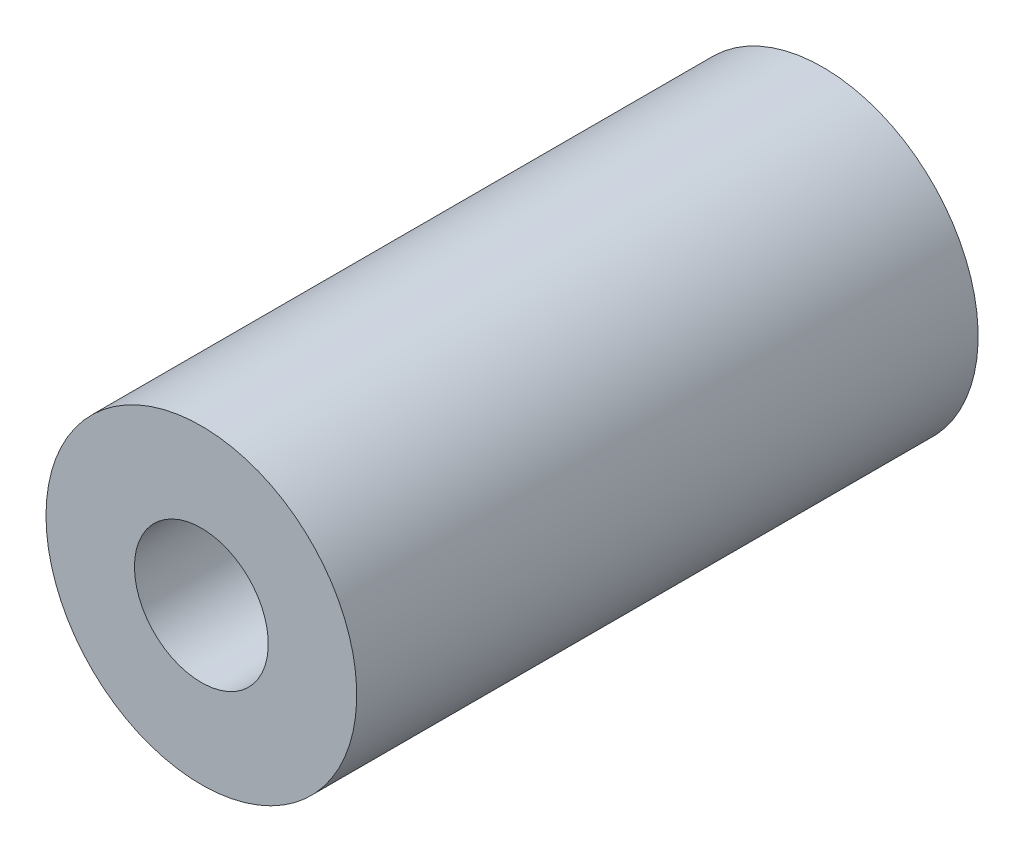
ISO-10303-21;
HEADER;
FILE_DESCRIPTION(('STEP AP214'),'2;1');
FILE_NAME('part.step','',(''),(''),'','','');
FILE_SCHEMA(('AUTOMOTIVE_DESIGN { 1 0 10303 214 1 1 1 1 }'));
ENDSEC;
DATA;
#1=APPLICATION_CONTEXT('core data for automotive mechanical design processes');
#2=APPLICATION_PROTOCOL_DEFINITION('international standard','automotive_design',2000,#1);
#3=PRODUCT_CONTEXT('',#1,'mechanical');
#4=PRODUCT('Part','Part','',(#3));
#5=PRODUCT_RELATED_PRODUCT_CATEGORY('part','',(#4));
#6=PRODUCT_DEFINITION_FORMATION('','',#4);
#7=PRODUCT_DEFINITION_CONTEXT('part definition',#1,'design');
#8=PRODUCT_DEFINITION('design','',#6,#7);
#9=PRODUCT_DEFINITION_SHAPE('','',#8);
#10=(LENGTH_UNIT() NAMED_UNIT(*) SI_UNIT(.MILLI.,.METRE.));
#11=(NAMED_UNIT(*) PLANE_ANGLE_UNIT() SI_UNIT($,.RADIAN.));
#12=(NAMED_UNIT(*) SI_UNIT($,.STERADIAN.) SOLID_ANGLE_UNIT());
#13=UNCERTAINTY_MEASURE_WITH_UNIT(LENGTH_MEASURE(1.E-05),#10,'distance_accuracy_value','');
#14=(GEOMETRIC_REPRESENTATION_CONTEXT(3) GLOBAL_UNCERTAINTY_ASSIGNED_CONTEXT((#13)) GLOBAL_UNIT_ASSIGNED_CONTEXT((#10,
#11,#12)) REPRESENTATION_CONTEXT('',''));
#15=CARTESIAN_POINT('',(0.,0.,0.));
#16=DIRECTION('',(0.,0.,1.));
#17=DIRECTION('',(1.,0.,0.));
#18=AXIS2_PLACEMENT_3D('',#15,#16,#17);
#19=CARTESIAN_POINT('',(0.,0.,19.05));
#20=DIRECTION('',(0.,0.,1.));
#21=DIRECTION('',(1.,0.,0.));
#22=AXIS2_PLACEMENT_3D('',#19,#20,#21);
#23=PLANE('',#22);
#24=CARTESIAN_POINT('',(0.,0.,19.05));
#25=DIRECTION('',(0.,0.,1.));
#26=DIRECTION('',(1.,0.,0.));
#27=AXIS2_PLACEMENT_3D('',#24,#25,#26);
#28=CIRCLE('',#27,9.525);
#29=CARTESIAN_POINT('',(-9.525,0.,19.05));
#30=VERTEX_POINT('',#29);
#31=EDGE_CURVE('E10',#30,#30,#28,.T.);
#32=ORIENTED_EDGE('',*,*,#31,.T.);
#33=EDGE_LOOP('',(#32));
#34=FACE_BOUND('',#33,.T.);
#35=CARTESIAN_POINT('',(0.,0.,19.05));
#36=DIRECTION('',(0.,0.,1.));
#37=DIRECTION('',(1.,0.,0.));
#38=AXIS2_PLACEMENT_3D('',#35,#36,#37);
#39=CIRCLE('',#38,4.1021);
#40=CARTESIAN_POINT('',(-4.1021,0.,19.05));
#41=VERTEX_POINT('',#40);
#42=EDGE_CURVE('E41',#41,#41,#39,.T.);
#43=ORIENTED_EDGE('',*,*,#42,.F.);
#44=EDGE_LOOP('',(#43));
#45=FACE_BOUND('',#44,.T.);
#46=ADVANCED_FACE('F30',(#34,#45),#23,.T.);
#47=CARTESIAN_POINT('',(0.,0.,-19.05));
#48=DIRECTION('',(0.,0.,1.));
#49=DIRECTION('',(1.,0.,0.));
#50=AXIS2_PLACEMENT_3D('',#47,#48,#49);
#51=PLANE('',#50);
#52=CARTESIAN_POINT('',(0.,0.,-19.05));
#53=DIRECTION('',(0.,0.,1.));
#54=DIRECTION('',(1.,0.,0.));
#55=AXIS2_PLACEMENT_3D('',#52,#53,#54);
#56=CIRCLE('',#55,9.525);
#57=CARTESIAN_POINT('',(-9.525,0.,-19.05));
#58=VERTEX_POINT('',#57);
#59=EDGE_CURVE('E34',#58,#58,#56,.T.);
#60=ORIENTED_EDGE('',*,*,#59,.F.);
#61=EDGE_LOOP('',(#60));
#62=FACE_BOUND('',#61,.T.);
#63=CARTESIAN_POINT('',(0.,0.,-19.05));
#64=DIRECTION('',(0.,0.,1.));
#65=DIRECTION('',(1.,0.,0.));
#66=AXIS2_PLACEMENT_3D('',#63,#64,#65);
#67=CIRCLE('',#66,4.1021);
#68=CARTESIAN_POINT('',(-4.1021,0.,-19.05));
#69=VERTEX_POINT('',#68);
#70=EDGE_CURVE('E43',#69,#69,#67,.T.);
#71=ORIENTED_EDGE('',*,*,#70,.T.);
#72=EDGE_LOOP('',(#71));
#73=FACE_BOUND('',#72,.T.);
#74=ADVANCED_FACE('F53',(#62,#73),#51,.F.);
#75=CARTESIAN_POINT('',(0.,0.,19.05));
#76=DIRECTION('',(0.,0.,-1.));
#77=DIRECTION('',(-1.,0.,0.));
#78=AXIS2_PLACEMENT_3D('',#75,#76,#77);
#79=CYLINDRICAL_SURFACE('',#78,9.525);
#80=CARTESIAN_POINT('',(-9.525,0.,19.05));
#81=CARTESIAN_POINT('',(-9.525,0.,18.653125));
#82=CARTESIAN_POINT('',(-9.525,0.,18.25625));
#83=CARTESIAN_POINT('',(-9.525,0.,17.4625));
#84=CARTESIAN_POINT('',(-9.525,0.,17.065625));
#85=CARTESIAN_POINT('',(-9.525,0.,16.271875));
#86=CARTESIAN_POINT('',(-9.525,0.,15.875));
#87=CARTESIAN_POINT('',(-9.525,0.,15.08125));
#88=CARTESIAN_POINT('',(-9.525,0.,14.684375));
#89=CARTESIAN_POINT('',(-9.525,0.,13.890625));
#90=CARTESIAN_POINT('',(-9.525,0.,13.49375));
#91=CARTESIAN_POINT('',(-9.525,0.,12.7));
#92=CARTESIAN_POINT('',(-9.525,0.,12.303125));
#93=CARTESIAN_POINT('',(-9.525,0.,11.509375));
#94=CARTESIAN_POINT('',(-9.525,0.,11.1125));
#95=CARTESIAN_POINT('',(-9.525,0.,10.31875));
#96=CARTESIAN_POINT('',(-9.525,0.,9.921875));
#97=CARTESIAN_POINT('',(-9.525,0.,9.128125));
#98=CARTESIAN_POINT('',(-9.525,0.,8.73125));
#99=CARTESIAN_POINT('',(-9.525,0.,7.9375));
#100=CARTESIAN_POINT('',(-9.525,0.,7.540625));
#101=CARTESIAN_POINT('',(-9.525,0.,6.746875));
#102=CARTESIAN_POINT('',(-9.525,0.,6.35));
#103=CARTESIAN_POINT('',(-9.525,0.,5.55625));
#104=CARTESIAN_POINT('',(-9.525,0.,5.159375));
#105=CARTESIAN_POINT('',(-9.525,0.,4.365625));
#106=CARTESIAN_POINT('',(-9.525,0.,3.96875));
#107=CARTESIAN_POINT('',(-9.525,0.,3.175));
#108=CARTESIAN_POINT('',(-9.525,0.,2.778125));
#109=CARTESIAN_POINT('',(-9.525,0.,1.984375));
#110=CARTESIAN_POINT('',(-9.525,0.,1.5875));
#111=CARTESIAN_POINT('',(-9.525,0.,0.79375));
#112=CARTESIAN_POINT('',(-9.525,0.,0.396875));
#113=CARTESIAN_POINT('',(-9.525,0.,-0.396875));
#114=CARTESIAN_POINT('',(-9.525,0.,-0.79375));
#115=CARTESIAN_POINT('',(-9.525,0.,-1.5875));
#116=CARTESIAN_POINT('',(-9.525,0.,-1.984375));
#117=CARTESIAN_POINT('',(-9.525,0.,-2.778125));
#118=CARTESIAN_POINT('',(-9.525,0.,-3.175));
#119=CARTESIAN_POINT('',(-9.525,0.,-3.96875));
#120=CARTESIAN_POINT('',(-9.525,0.,-4.365625));
#121=CARTESIAN_POINT('',(-9.525,0.,-5.159375));
#122=CARTESIAN_POINT('',(-9.525,0.,-5.55625));
#123=CARTESIAN_POINT('',(-9.525,0.,-6.35));
#124=CARTESIAN_POINT('',(-9.525,0.,-6.746875));
#125=CARTESIAN_POINT('',(-9.525,0.,-7.540625));
#126=CARTESIAN_POINT('',(-9.525,0.,-7.9375));
#127=CARTESIAN_POINT('',(-9.525,0.,-8.73125));
#128=CARTESIAN_POINT('',(-9.525,0.,-9.128125));
#129=CARTESIAN_POINT('',(-9.525,0.,-9.921875));
#130=CARTESIAN_POINT('',(-9.525,0.,-10.31875));
#131=CARTESIAN_POINT('',(-9.525,0.,-11.1125));
#132=CARTESIAN_POINT('',(-9.525,0.,-11.509375));
#133=CARTESIAN_POINT('',(-9.525,0.,-12.303125));
#134=CARTESIAN_POINT('',(-9.525,0.,-12.7));
#135=CARTESIAN_POINT('',(-9.525,0.,-13.49375));
#136=CARTESIAN_POINT('',(-9.525,0.,-13.890625));
#137=CARTESIAN_POINT('',(-9.525,0.,-14.684375));
#138=CARTESIAN_POINT('',(-9.525,0.,-15.08125));
#139=CARTESIAN_POINT('',(-9.525,0.,-15.875));
#140=CARTESIAN_POINT('',(-9.525,0.,-16.271875));
#141=CARTESIAN_POINT('',(-9.525,0.,-17.065625));
#142=CARTESIAN_POINT('',(-9.525,0.,-17.4625));
#143=CARTESIAN_POINT('',(-9.525,0.,-18.25625));
#144=CARTESIAN_POINT('',(-9.525,0.,-18.653125));
#145=CARTESIAN_POINT('',(-9.525,0.,-19.05));
#146=B_SPLINE_CURVE_WITH_KNOTS('',3,(#80,#81,#82,#83,#84,#85,#86,#87,#88,#89,#90,#91,#92,#93,
#94,#95,#96,#97,#98,#99,#100,#101,#102,#103,#104,#105,#106,#107,#108,#109,#110,#111,#112,#113,
#114,#115,#116,#117,#118,#119,#120,#121,#122,#123,#124,#125,#126,#127,#128,#129,#130,#131,#132,
#133,#134,#135,#136,#137,#138,#139,#140,#141,#142,#143,#144,#145),.UNSPECIFIED.,.F.,.F.,(4,2,2,
2,2,2,2,2,2,2,2,2,2,2,2,2,2,2,2,2,2,2,2,2,2,2,2,2,2,2,2,2,4),(0.,1.190625,2.38125,3.571875,
4.7625,5.953125,7.14375,8.334375,9.525,10.715625,11.90625,13.096875,14.2875,15.478125,16.66875,
17.859375,19.05,20.240625,21.43125,22.621875,23.8125,25.003125,26.19375,27.384375,28.575,
29.765625,30.95625,32.146875,33.3375,34.528125,35.71875,36.909375,38.1),.UNSPECIFIED.);
#147=EDGE_CURVE('BSEAM32',#30,#58,#146,.T.);
#148=ORIENTED_EDGE('',*,*,#31,.F.);
#149=ORIENTED_EDGE('',*,*,#59,.T.);
#150=ORIENTED_EDGE('',*,*,#147,.T.);
#151=ORIENTED_EDGE('',*,*,#147,.F.);
#152=EDGE_LOOP('',(#148,#150,#149,#151));
#153=FACE_BOUND('',#152,.T.);
#154=ADVANCED_FACE('F32',(#153),#79,.T.);
#155=CARTESIAN_POINT('',(0.,0.,19.05));
#156=DIRECTION('',(0.,0.,-1.));
#157=DIRECTION('',(-1.,0.,0.));
#158=AXIS2_PLACEMENT_3D('',#155,#156,#157);
#159=CYLINDRICAL_SURFACE('',#158,4.1021);
#160=CARTESIAN_POINT('',(-4.1021,0.,19.05));
#161=CARTESIAN_POINT('',(-4.1021,0.,18.653125));
#162=CARTESIAN_POINT('',(-4.1021,0.,18.25625));
#163=CARTESIAN_POINT('',(-4.1021,0.,17.4625));
#164=CARTESIAN_POINT('',(-4.1021,0.,17.065625));
#165=CARTESIAN_POINT('',(-4.1021,0.,16.271875));
#166=CARTESIAN_POINT('',(-4.1021,0.,15.875));
#167=CARTESIAN_POINT('',(-4.1021,0.,15.08125));
#168=CARTESIAN_POINT('',(-4.1021,0.,14.684375));
#169=CARTESIAN_POINT('',(-4.1021,0.,13.890625));
#170=CARTESIAN_POINT('',(-4.1021,0.,13.49375));
#171=CARTESIAN_POINT('',(-4.1021,0.,12.7));
#172=CARTESIAN_POINT('',(-4.1021,0.,12.303125));
#173=CARTESIAN_POINT('',(-4.1021,0.,11.509375));
#174=CARTESIAN_POINT('',(-4.1021,0.,11.1125));
#175=CARTESIAN_POINT('',(-4.1021,0.,10.31875));
#176=CARTESIAN_POINT('',(-4.1021,0.,9.921875));
#177=CARTESIAN_POINT('',(-4.1021,0.,9.128125));
#178=CARTESIAN_POINT('',(-4.1021,0.,8.73125));
#179=CARTESIAN_POINT('',(-4.1021,0.,7.9375));
#180=CARTESIAN_POINT('',(-4.1021,0.,7.540625));
#181=CARTESIAN_POINT('',(-4.1021,0.,6.746875));
#182=CARTESIAN_POINT('',(-4.1021,0.,6.35));
#183=CARTESIAN_POINT('',(-4.1021,0.,5.55625));
#184=CARTESIAN_POINT('',(-4.1021,0.,5.159375));
#185=CARTESIAN_POINT('',(-4.1021,0.,4.365625));
#186=CARTESIAN_POINT('',(-4.1021,0.,3.96875));
#187=CARTESIAN_POINT('',(-4.1021,0.,3.175));
#188=CARTESIAN_POINT('',(-4.1021,0.,2.778125));
#189=CARTESIAN_POINT('',(-4.1021,0.,1.984375));
#190=CARTESIAN_POINT('',(-4.1021,0.,1.5875));
#191=CARTESIAN_POINT('',(-4.1021,0.,0.79375));
#192=CARTESIAN_POINT('',(-4.1021,0.,0.396875));
#193=CARTESIAN_POINT('',(-4.1021,0.,-0.396875));
#194=CARTESIAN_POINT('',(-4.1021,0.,-0.79375));
#195=CARTESIAN_POINT('',(-4.1021,0.,-1.5875));
#196=CARTESIAN_POINT('',(-4.1021,0.,-1.984375));
#197=CARTESIAN_POINT('',(-4.1021,0.,-2.778125));
#198=CARTESIAN_POINT('',(-4.1021,0.,-3.175));
#199=CARTESIAN_POINT('',(-4.1021,0.,-3.96875));
#200=CARTESIAN_POINT('',(-4.1021,0.,-4.365625));
#201=CARTESIAN_POINT('',(-4.1021,0.,-5.159375));
#202=CARTESIAN_POINT('',(-4.1021,0.,-5.55625));
#203=CARTESIAN_POINT('',(-4.1021,0.,-6.35));
#204=CARTESIAN_POINT('',(-4.1021,0.,-6.746875));
#205=CARTESIAN_POINT('',(-4.1021,0.,-7.540625));
#206=CARTESIAN_POINT('',(-4.1021,0.,-7.9375));
#207=CARTESIAN_POINT('',(-4.1021,0.,-8.73125));
#208=CARTESIAN_POINT('',(-4.1021,0.,-9.128125));
#209=CARTESIAN_POINT('',(-4.1021,0.,-9.921875));
#210=CARTESIAN_POINT('',(-4.1021,0.,-10.31875));
#211=CARTESIAN_POINT('',(-4.1021,0.,-11.1125));
#212=CARTESIAN_POINT('',(-4.1021,0.,-11.509375));
#213=CARTESIAN_POINT('',(-4.1021,0.,-12.303125));
#214=CARTESIAN_POINT('',(-4.1021,0.,-12.7));
#215=CARTESIAN_POINT('',(-4.1021,0.,-13.49375));
#216=CARTESIAN_POINT('',(-4.1021,0.,-13.890625));
#217=CARTESIAN_POINT('',(-4.1021,0.,-14.684375));
#218=CARTESIAN_POINT('',(-4.1021,0.,-15.08125));
#219=CARTESIAN_POINT('',(-4.1021,0.,-15.875));
#220=CARTESIAN_POINT('',(-4.1021,0.,-16.271875));
#221=CARTESIAN_POINT('',(-4.1021,0.,-17.065625));
#222=CARTESIAN_POINT('',(-4.1021,0.,-17.4625));
#223=CARTESIAN_POINT('',(-4.1021,0.,-18.25625));
#224=CARTESIAN_POINT('',(-4.1021,0.,-18.653125));
#225=CARTESIAN_POINT('',(-4.1021,0.,-19.05));
#226=B_SPLINE_CURVE_WITH_KNOTS('',3,(#160,#161,#162,#163,#164,#165,#166,#167,#168,#169,#170,
#171,#172,#173,#174,#175,#176,#177,#178,#179,#180,#181,#182,#183,#184,#185,#186,#187,#188,#189,
#190,#191,#192,#193,#194,#195,#196,#197,#198,#199,#200,#201,#202,#203,#204,#205,#206,#207,#208,
#209,#210,#211,#212,#213,#214,#215,#216,#217,#218,#219,#220,#221,#222,#223,#224,#225),
.UNSPECIFIED.,.F.,.F.,(4,2,2,2,2,2,2,2,2,2,2,2,2,2,2,2,2,2,2,2,2,2,2,2,2,2,2,2,2,2,2,2,4),(0.,
1.190625,2.38125,3.571875,4.7625,5.953125,7.14375,8.334375,9.525,10.715625,11.90625,13.096875,
14.2875,15.478125,16.66875,17.859375,19.05,20.240625,21.43125,22.621875,23.8125,25.003125,
26.19375,27.384375,28.575,29.765625,30.95625,32.146875,33.3375,34.528125,35.71875,36.909375,
38.1),.UNSPECIFIED.);
#227=EDGE_CURVE('BSEAM49',#41,#69,#226,.T.);
#228=ORIENTED_EDGE('',*,*,#42,.T.);
#229=ORIENTED_EDGE('',*,*,#70,.F.);
#230=ORIENTED_EDGE('',*,*,#227,.T.);
#231=ORIENTED_EDGE('',*,*,#227,.F.);
#232=EDGE_LOOP('',(#228,#230,#229,#231));
#233=FACE_BOUND('',#232,.T.);
#234=ADVANCED_FACE('F49',(#233),#159,.F.);
#235=CLOSED_SHELL('',(#46,#74,#154,#234));
#236=MANIFOLD_SOLID_BREP('B2',#235);
#237=ADVANCED_BREP_SHAPE_REPRESENTATION('',(#18,#236),#14);
#238=SHAPE_DEFINITION_REPRESENTATION(#9,#237);
ENDSEC;
END-ISO-10303-21;
